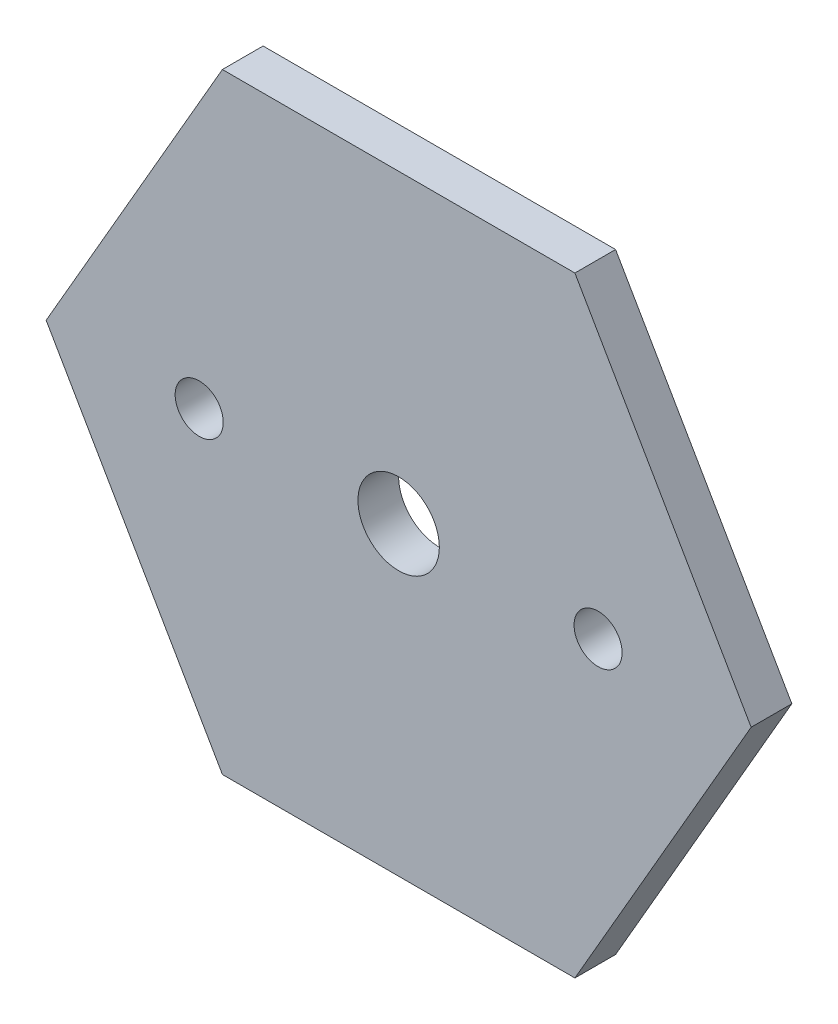
ISO-10303-21;
HEADER;
FILE_DESCRIPTION(('STEP AP214'),'2;1');
FILE_NAME('part.step','',(''),(''),'','','');
FILE_SCHEMA(('AUTOMOTIVE_DESIGN { 1 0 10303 214 1 1 1 1 }'));
ENDSEC;
DATA;
#1=APPLICATION_CONTEXT('core data for automotive mechanical design processes');
#2=APPLICATION_PROTOCOL_DEFINITION('international standard','automotive_design',2000,#1);
#3=PRODUCT_CONTEXT('',#1,'mechanical');
#4=PRODUCT('Part','Part','',(#3));
#5=PRODUCT_RELATED_PRODUCT_CATEGORY('part','',(#4));
#6=PRODUCT_DEFINITION_FORMATION('','',#4);
#7=PRODUCT_DEFINITION_CONTEXT('part definition',#1,'design');
#8=PRODUCT_DEFINITION('design','',#6,#7);
#9=PRODUCT_DEFINITION_SHAPE('','',#8);
#10=(LENGTH_UNIT() NAMED_UNIT(*) SI_UNIT(.MILLI.,.METRE.));
#11=(NAMED_UNIT(*) PLANE_ANGLE_UNIT() SI_UNIT($,.RADIAN.));
#12=(NAMED_UNIT(*) SI_UNIT($,.STERADIAN.) SOLID_ANGLE_UNIT());
#13=UNCERTAINTY_MEASURE_WITH_UNIT(LENGTH_MEASURE(1.E-05),#10,'distance_accuracy_value','');
#14=(GEOMETRIC_REPRESENTATION_CONTEXT(3) GLOBAL_UNCERTAINTY_ASSIGNED_CONTEXT((#13)) GLOBAL_UNIT_ASSIGNED_CONTEXT((#10,
#11,#12)) REPRESENTATION_CONTEXT('',''));
#15=CARTESIAN_POINT('',(0.,0.,0.));
#16=DIRECTION('',(0.,0.,1.));
#17=DIRECTION('',(1.,0.,0.));
#18=AXIS2_PLACEMENT_3D('',#15,#16,#17);
#19=CARTESIAN_POINT('',(0.,0.,2.54));
#20=DIRECTION('',(0.,0.,1.));
#21=DIRECTION('',(1.,0.,0.));
#22=AXIS2_PLACEMENT_3D('',#19,#20,#21);
#23=PLANE('',#22);
#24=CARTESIAN_POINT('',(12.4459999967047,0.000286400833943028,2.54));
#25=DIRECTION('',(0.,0.,1.));
#26=DIRECTION('',(1.,0.,0.));
#27=AXIS2_PLACEMENT_3D('',#24,#25,#26);
#28=CIRCLE('',#27,1.499997);
#29=CARTESIAN_POINT('',(13.9459969967047,0.000286400833943028,2.54));
#30=VERTEX_POINT('',#29);
#31=EDGE_CURVE('E207',#30,#30,#28,.T.);
#32=ORIENTED_EDGE('',*,*,#31,.F.);
#33=EDGE_LOOP('',(#32));
#34=FACE_BOUND('',#33,.T.);
#35=DIRECTION('',(-0.500019928390667,0.866013897817,0.));
#36=VECTOR('',#35,1.);
#37=CARTESIAN_POINT('',(21.9970452503007,0.000506184485429711,2.54));
#38=LINE('',#37,#36);
#39=CARTESIAN_POINT('',(21.9970452503007,0.000506184485429711,2.54));
#40=VERTEX_POINT('',#39);
#41=CARTESIAN_POINT('',(10.998084256527,19.050253087199,2.54));
#42=VERTEX_POINT('',#41);
#43=EDGE_CURVE('E146',#40,#42,#38,.T.);
#44=ORIENTED_EDGE('',*,*,#43,.T.);
#45=DIRECTION('',(-0.999999999735236,-2.30114762925443E-05,0.));
#46=VECTOR('',#45,1.);
#47=CARTESIAN_POINT('',(10.998084256527,19.050253087199,2.54));
#48=LINE('',#47,#46);
#49=CARTESIAN_POINT('',(-10.9989609937737,19.0497469027135,2.54));
#50=VERTEX_POINT('',#49);
#51=EDGE_CURVE('E94',#42,#50,#48,.T.);
#52=ORIENTED_EDGE('',*,*,#51,.T.);
#53=DIRECTION('',(-0.499980071344569,-0.866036909293293,0.));
#54=VECTOR('',#53,1.);
#55=CARTESIAN_POINT('',(-10.9989609937737,19.0497469027135,2.54));
#56=LINE('',#55,#54);
#57=CARTESIAN_POINT('',(-21.9970452503007,-0.000506184485433809,2.54));
#58=VERTEX_POINT('',#57);
#59=EDGE_CURVE('E107',#50,#58,#56,.T.);
#60=ORIENTED_EDGE('',*,*,#59,.T.);
#61=DIRECTION('',(0.500019928390667,-0.866013897817,0.));
#62=VECTOR('',#61,1.);
#63=CARTESIAN_POINT('',(-21.9970452503007,-0.000506184485433809,2.54));
#64=LINE('',#63,#62);
#65=CARTESIAN_POINT('',(-10.998084256527,-19.050253087199,2.54));
#66=VERTEX_POINT('',#65);
#67=EDGE_CURVE('E101',#58,#66,#64,.T.);
#68=ORIENTED_EDGE('',*,*,#67,.T.);
#69=DIRECTION('',(0.999999999735236,2.30114762928597E-05,0.));
#70=VECTOR('',#69,1.);
#71=CARTESIAN_POINT('',(-10.998084256527,-19.050253087199,2.54));
#72=LINE('',#71,#70);
#73=CARTESIAN_POINT('',(10.9989609937737,-19.0497469027135,2.54));
#74=VERTEX_POINT('',#73);
#75=EDGE_CURVE('E105',#66,#74,#72,.T.);
#76=ORIENTED_EDGE('',*,*,#75,.T.);
#77=DIRECTION('',(0.499980071344569,0.866036909293293,0.));
#78=VECTOR('',#77,1.);
#79=CARTESIAN_POINT('',(10.9989609937737,-19.0497469027135,2.54));
#80=LINE('',#79,#78);
#81=EDGE_CURVE('E57',#74,#40,#80,.T.);
#82=ORIENTED_EDGE('',*,*,#81,.T.);
#83=EDGE_LOOP('',(#44,#52,#60,#68,#76,#82));
#84=FACE_BOUND('',#83,.T.);
#85=CARTESIAN_POINT('',(-12.4459999967047,-0.000286400833946046,2.54));
#86=DIRECTION('',(0.,0.,1.));
#87=DIRECTION('',(1.,0.,0.));
#88=AXIS2_PLACEMENT_3D('',#85,#86,#87);
#89=CIRCLE('',#88,1.5);
#90=CARTESIAN_POINT('',(-10.9459999967047,-0.000286400833946046,2.54));
#91=VERTEX_POINT('',#90);
#92=EDGE_CURVE('E134',#91,#91,#89,.T.);
#93=ORIENTED_EDGE('',*,*,#92,.F.);
#94=EDGE_LOOP('',(#93));
#95=FACE_BOUND('',#94,.T.);
#96=CARTESIAN_POINT('',(0.,0.,2.54));
#97=DIRECTION('',(0.,0.,1.));
#98=DIRECTION('',(1.,0.,0.));
#99=AXIS2_PLACEMENT_3D('',#96,#97,#98);
#100=CIRCLE('',#99,2.54);
#101=CARTESIAN_POINT('',(2.54,0.,2.54));
#102=VERTEX_POINT('',#101);
#103=EDGE_CURVE('E196',#102,#102,#100,.T.);
#104=ORIENTED_EDGE('',*,*,#103,.F.);
#105=EDGE_LOOP('',(#104));
#106=FACE_BOUND('',#105,.T.);
#107=ADVANCED_FACE('F39',(#34,#84,#95,#106),#23,.T.);
#108=CARTESIAN_POINT('',(0.,0.,0.));
#109=DIRECTION('',(0.,0.,1.));
#110=DIRECTION('',(1.,0.,0.));
#111=AXIS2_PLACEMENT_3D('',#108,#109,#110);
#112=PLANE('',#111);
#113=DIRECTION('',(-0.500019928390667,0.866013897817,0.));
#114=VECTOR('',#113,1.);
#115=CARTESIAN_POINT('',(21.9970452503007,0.000506184485429711,0.));
#116=LINE('',#115,#114);
#117=CARTESIAN_POINT('',(21.9970452503007,0.000506184485429711,0.));
#118=VERTEX_POINT('',#117);
#119=CARTESIAN_POINT('',(10.998084256527,19.050253087199,0.));
#120=VERTEX_POINT('',#119);
#121=EDGE_CURVE('E129',#118,#120,#116,.T.);
#122=ORIENTED_EDGE('',*,*,#121,.F.);
#123=DIRECTION('',(0.499980071344569,0.866036909293293,0.));
#124=VECTOR('',#123,1.);
#125=CARTESIAN_POINT('',(10.9989609937737,-19.0497469027135,0.));
#126=LINE('',#125,#124);
#127=CARTESIAN_POINT('',(10.9989609937737,-19.0497469027135,0.));
#128=VERTEX_POINT('',#127);
#129=EDGE_CURVE('E86',#128,#118,#126,.T.);
#130=ORIENTED_EDGE('',*,*,#129,.F.);
#131=DIRECTION('',(0.999999999735236,2.30114762928597E-05,0.));
#132=VECTOR('',#131,1.);
#133=CARTESIAN_POINT('',(-10.998084256527,-19.050253087199,0.));
#134=LINE('',#133,#132);
#135=CARTESIAN_POINT('',(-10.998084256527,-19.050253087199,0.));
#136=VERTEX_POINT('',#135);
#137=EDGE_CURVE('E80',#136,#128,#134,.T.);
#138=ORIENTED_EDGE('',*,*,#137,.F.);
#139=DIRECTION('',(0.500019928390667,-0.866013897817,0.));
#140=VECTOR('',#139,1.);
#141=CARTESIAN_POINT('',(-21.9970452503007,-0.000506184485433809,0.));
#142=LINE('',#141,#140);
#143=CARTESIAN_POINT('',(-21.9970452503007,-0.000506184485433809,0.));
#144=VERTEX_POINT('',#143);
#145=EDGE_CURVE('E116',#144,#136,#142,.T.);
#146=ORIENTED_EDGE('',*,*,#145,.F.);
#147=DIRECTION('',(-0.499980071344569,-0.866036909293293,0.));
#148=VECTOR('',#147,1.);
#149=CARTESIAN_POINT('',(-10.9989609937737,19.0497469027135,0.));
#150=LINE('',#149,#148);
#151=CARTESIAN_POINT('',(-10.9989609937737,19.0497469027135,0.));
#152=VERTEX_POINT('',#151);
#153=EDGE_CURVE('E137',#152,#144,#150,.T.);
#154=ORIENTED_EDGE('',*,*,#153,.F.);
#155=DIRECTION('',(-0.999999999735236,-2.30114762925443E-05,0.));
#156=VECTOR('',#155,1.);
#157=CARTESIAN_POINT('',(10.998084256527,19.050253087199,0.));
#158=LINE('',#157,#156);
#159=EDGE_CURVE('E133',#120,#152,#158,.T.);
#160=ORIENTED_EDGE('',*,*,#159,.F.);
#161=EDGE_LOOP('',(#122,#130,#138,#146,#154,#160));
#162=FACE_BOUND('',#161,.T.);
#163=CARTESIAN_POINT('',(-12.4459999967047,-0.000286400833946046,0.));
#164=DIRECTION('',(0.,0.,1.));
#165=DIRECTION('',(1.,0.,0.));
#166=AXIS2_PLACEMENT_3D('',#163,#164,#165);
#167=CIRCLE('',#166,1.5);
#168=CARTESIAN_POINT('',(-10.9459999967047,-0.000286400833946046,0.));
#169=VERTEX_POINT('',#168);
#170=EDGE_CURVE('E211',#169,#169,#167,.T.);
#171=ORIENTED_EDGE('',*,*,#170,.T.);
#172=EDGE_LOOP('',(#171));
#173=FACE_BOUND('',#172,.T.);
#174=CARTESIAN_POINT('',(12.4459999967047,0.000286400833943028,0.));
#175=DIRECTION('',(0.,0.,1.));
#176=DIRECTION('',(1.,0.,0.));
#177=AXIS2_PLACEMENT_3D('',#174,#175,#176);
#178=CIRCLE('',#177,1.499997);
#179=CARTESIAN_POINT('',(13.9459969967047,0.000286400833943028,0.));
#180=VERTEX_POINT('',#179);
#181=EDGE_CURVE('E204',#180,#180,#178,.T.);
#182=ORIENTED_EDGE('',*,*,#181,.T.);
#183=EDGE_LOOP('',(#182));
#184=FACE_BOUND('',#183,.T.);
#185=CARTESIAN_POINT('',(0.,0.,0.));
#186=DIRECTION('',(0.,0.,1.));
#187=DIRECTION('',(1.,0.,0.));
#188=AXIS2_PLACEMENT_3D('',#185,#186,#187);
#189=CIRCLE('',#188,2.54);
#190=CARTESIAN_POINT('',(2.54,0.,0.));
#191=VERTEX_POINT('',#190);
#192=EDGE_CURVE('E199',#191,#191,#189,.T.);
#193=ORIENTED_EDGE('',*,*,#192,.T.);
#194=EDGE_LOOP('',(#193));
#195=FACE_BOUND('',#194,.T.);
#196=ADVANCED_FACE('F159',(#162,#173,#184,#195),#112,.F.);
#197=CARTESIAN_POINT('',(21.9970452503007,0.000506184485429711,2.54));
#198=DIRECTION('',(-0.866013897817,-0.500019928390667,0.));
#199=DIRECTION('',(0.500019928390667,-0.866013897817,0.));
#200=AXIS2_PLACEMENT_3D('',#197,#198,#199);
#201=PLANE('',#200);
#202=ORIENTED_EDGE('',*,*,#121,.T.);
#203=DIRECTION('',(0.,0.,-1.));
#204=VECTOR('',#203,1.);
#205=CARTESIAN_POINT('',(10.998084256527,19.050253087199,2.54));
#206=LINE('',#205,#204);
#207=EDGE_CURVE('E11',#42,#120,#206,.T.);
#208=ORIENTED_EDGE('',*,*,#207,.F.);
#209=ORIENTED_EDGE('',*,*,#43,.F.);
#210=DIRECTION('',(0.,0.,-1.));
#211=VECTOR('',#210,1.);
#212=CARTESIAN_POINT('',(21.9970452503007,0.000506184485429711,2.54));
#213=LINE('',#212,#211);
#214=EDGE_CURVE('E125',#40,#118,#213,.T.);
#215=ORIENTED_EDGE('',*,*,#214,.T.);
#216=EDGE_LOOP('',(#202,#208,#209,#215));
#217=FACE_BOUND('',#216,.T.);
#218=ADVANCED_FACE('F41',(#217),#201,.F.);
#219=CARTESIAN_POINT('',(10.998084256527,19.050253087199,2.54));
#220=DIRECTION('',(2.30114762925443E-05,-0.999999999735236,0.));
#221=DIRECTION('',(0.999999999735236,2.30114762925443E-05,0.));
#222=AXIS2_PLACEMENT_3D('',#219,#220,#221);
#223=PLANE('',#222);
#224=ORIENTED_EDGE('',*,*,#159,.T.);
#225=DIRECTION('',(0.,0.,-1.));
#226=VECTOR('',#225,1.);
#227=CARTESIAN_POINT('',(-10.9989609937737,19.0497469027135,2.54));
#228=LINE('',#227,#226);
#229=EDGE_CURVE('E49',#50,#152,#228,.T.);
#230=ORIENTED_EDGE('',*,*,#229,.F.);
#231=ORIENTED_EDGE('',*,*,#51,.F.);
#232=ORIENTED_EDGE('',*,*,#207,.T.);
#233=EDGE_LOOP('',(#224,#230,#231,#232));
#234=FACE_BOUND('',#233,.T.);
#235=ADVANCED_FACE('F267',(#234),#223,.F.);
#236=CARTESIAN_POINT('',(-10.9989609937737,19.0497469027135,2.54));
#237=DIRECTION('',(0.866036909293293,-0.499980071344569,0.));
#238=DIRECTION('',(0.499980071344569,0.866036909293293,0.));
#239=AXIS2_PLACEMENT_3D('',#236,#237,#238);
#240=PLANE('',#239);
#241=ORIENTED_EDGE('',*,*,#153,.T.);
#242=DIRECTION('',(0.,0.,-1.));
#243=VECTOR('',#242,1.);
#244=CARTESIAN_POINT('',(-21.9970452503007,-0.000506184485433809,2.54));
#245=LINE('',#244,#243);
#246=EDGE_CURVE('E118',#58,#144,#245,.T.);
#247=ORIENTED_EDGE('',*,*,#246,.F.);
#248=ORIENTED_EDGE('',*,*,#59,.F.);
#249=ORIENTED_EDGE('',*,*,#229,.T.);
#250=EDGE_LOOP('',(#241,#247,#248,#249));
#251=FACE_BOUND('',#250,.T.);
#252=ADVANCED_FACE('F156',(#251),#240,.F.);
#253=CARTESIAN_POINT('',(-21.9970452503007,-0.000506184485433809,2.54));
#254=DIRECTION('',(0.866013897817,0.500019928390666,0.));
#255=DIRECTION('',(-0.500019928390666,0.866013897817,0.));
#256=AXIS2_PLACEMENT_3D('',#253,#254,#255);
#257=PLANE('',#256);
#258=ORIENTED_EDGE('',*,*,#145,.T.);
#259=DIRECTION('',(0.,0.,-1.));
#260=VECTOR('',#259,1.);
#261=CARTESIAN_POINT('',(-10.998084256527,-19.050253087199,2.54));
#262=LINE('',#261,#260);
#263=EDGE_CURVE('E113',#66,#136,#262,.T.);
#264=ORIENTED_EDGE('',*,*,#263,.F.);
#265=ORIENTED_EDGE('',*,*,#67,.F.);
#266=ORIENTED_EDGE('',*,*,#246,.T.);
#267=EDGE_LOOP('',(#258,#264,#265,#266));
#268=FACE_BOUND('',#267,.T.);
#269=ADVANCED_FACE('F114',(#268),#257,.F.);
#270=CARTESIAN_POINT('',(-10.998084256527,-19.050253087199,2.54));
#271=DIRECTION('',(-2.30114762928597E-05,0.999999999735236,0.));
#272=DIRECTION('',(-0.999999999735236,-2.30114762928597E-05,0.));
#273=AXIS2_PLACEMENT_3D('',#270,#271,#272);
#274=PLANE('',#273);
#275=ORIENTED_EDGE('',*,*,#137,.T.);
#276=DIRECTION('',(0.,0.,-1.));
#277=VECTOR('',#276,1.);
#278=CARTESIAN_POINT('',(10.9989609937737,-19.0497469027135,2.54));
#279=LINE('',#278,#277);
#280=EDGE_CURVE('E119',#74,#128,#279,.T.);
#281=ORIENTED_EDGE('',*,*,#280,.F.);
#282=ORIENTED_EDGE('',*,*,#75,.F.);
#283=ORIENTED_EDGE('',*,*,#263,.T.);
#284=EDGE_LOOP('',(#275,#281,#282,#283));
#285=FACE_BOUND('',#284,.T.);
#286=ADVANCED_FACE('F121',(#285),#274,.F.);
#287=CARTESIAN_POINT('',(10.9989609937737,-19.0497469027135,2.54));
#288=DIRECTION('',(-0.866036909293293,0.499980071344569,0.));
#289=DIRECTION('',(-0.499980071344569,-0.866036909293293,0.));
#290=AXIS2_PLACEMENT_3D('',#287,#288,#289);
#291=PLANE('',#290);
#292=ORIENTED_EDGE('',*,*,#129,.T.);
#293=ORIENTED_EDGE('',*,*,#214,.F.);
#294=ORIENTED_EDGE('',*,*,#81,.F.);
#295=ORIENTED_EDGE('',*,*,#280,.T.);
#296=EDGE_LOOP('',(#292,#293,#294,#295));
#297=FACE_BOUND('',#296,.T.);
#298=ADVANCED_FACE('F164',(#297),#291,.F.);
#299=CARTESIAN_POINT('',(-12.4459999967047,-0.000286400833946046,2.54));
#300=DIRECTION('',(0.,0.,-1.));
#301=DIRECTION('',(-1.,0.,0.));
#302=AXIS2_PLACEMENT_3D('',#299,#300,#301);
#303=CYLINDRICAL_SURFACE('',#302,1.5);
#304=ORIENTED_EDGE('',*,*,#92,.T.);
#305=EDGE_LOOP('',(#304));
#306=FACE_BOUND('',#305,.T.);
#307=ORIENTED_EDGE('',*,*,#170,.F.);
#308=EDGE_LOOP('',(#307));
#309=FACE_BOUND('',#308,.T.);
#310=ADVANCED_FACE('F166',(#306,#309),#303,.F.);
#311=CARTESIAN_POINT('',(12.4459999967047,0.000286400833943028,2.54));
#312=DIRECTION('',(0.,0.,-1.));
#313=DIRECTION('',(-1.,0.,0.));
#314=AXIS2_PLACEMENT_3D('',#311,#312,#313);
#315=CYLINDRICAL_SURFACE('',#314,1.499997);
#316=ORIENTED_EDGE('',*,*,#31,.T.);
#317=EDGE_LOOP('',(#316));
#318=FACE_BOUND('',#317,.T.);
#319=ORIENTED_EDGE('',*,*,#181,.F.);
#320=EDGE_LOOP('',(#319));
#321=FACE_BOUND('',#320,.T.);
#322=ADVANCED_FACE('F172',(#318,#321),#315,.F.);
#323=CARTESIAN_POINT('',(0.,0.,2.54));
#324=DIRECTION('',(0.,0.,-1.));
#325=DIRECTION('',(-1.,0.,0.));
#326=AXIS2_PLACEMENT_3D('',#323,#324,#325);
#327=CYLINDRICAL_SURFACE('',#326,2.54);
#328=ORIENTED_EDGE('',*,*,#103,.T.);
#329=EDGE_LOOP('',(#328));
#330=FACE_BOUND('',#329,.T.);
#331=ORIENTED_EDGE('',*,*,#192,.F.);
#332=EDGE_LOOP('',(#331));
#333=FACE_BOUND('',#332,.T.);
#334=ADVANCED_FACE('F187',(#330,#333),#327,.F.);
#335=CLOSED_SHELL('',(#107,#196,#218,#235,#252,#269,#286,#298,#310,#322,#334));
#336=MANIFOLD_SOLID_BREP('B2',#335);
#337=ADVANCED_BREP_SHAPE_REPRESENTATION('',(#18,#336),#14);
#338=SHAPE_DEFINITION_REPRESENTATION(#9,#337);
ENDSEC;
END-ISO-10303-21;
